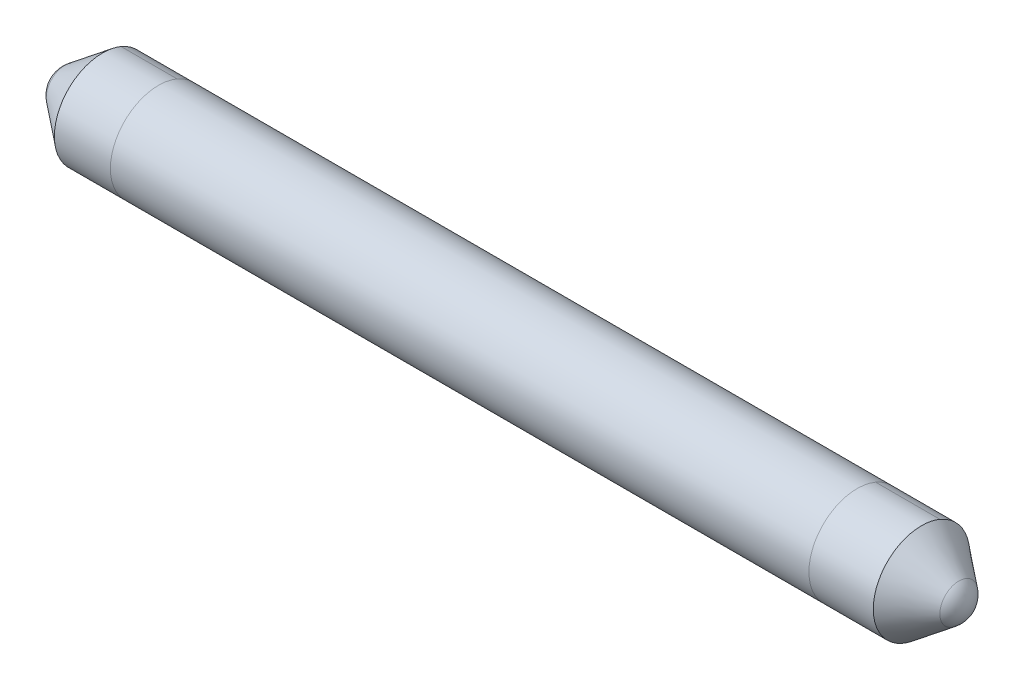
ISO-10303-21;
HEADER;
FILE_DESCRIPTION(('STEP AP214'),'2;1');
FILE_NAME('part.step','',(''),(''),'','','');
FILE_SCHEMA(('AUTOMOTIVE_DESIGN { 1 0 10303 214 1 1 1 1 }'));
ENDSEC;
DATA;
#1=APPLICATION_CONTEXT('core data for automotive mechanical design processes');
#2=APPLICATION_PROTOCOL_DEFINITION('international standard','automotive_design',2000,#1);
#3=PRODUCT_CONTEXT('',#1,'mechanical');
#4=PRODUCT('Part','Part','',(#3));
#5=PRODUCT_RELATED_PRODUCT_CATEGORY('part','',(#4));
#6=PRODUCT_DEFINITION_FORMATION('','',#4);
#7=PRODUCT_DEFINITION_CONTEXT('part definition',#1,'design');
#8=PRODUCT_DEFINITION('design','',#6,#7);
#9=PRODUCT_DEFINITION_SHAPE('','',#8);
#10=(LENGTH_UNIT() NAMED_UNIT(*) SI_UNIT(.MILLI.,.METRE.));
#11=(NAMED_UNIT(*) PLANE_ANGLE_UNIT() SI_UNIT($,.RADIAN.));
#12=(NAMED_UNIT(*) SI_UNIT($,.STERADIAN.) SOLID_ANGLE_UNIT());
#13=UNCERTAINTY_MEASURE_WITH_UNIT(LENGTH_MEASURE(1.E-05),#10,'distance_accuracy_value','');
#14=(GEOMETRIC_REPRESENTATION_CONTEXT(3) GLOBAL_UNCERTAINTY_ASSIGNED_CONTEXT((#13)) GLOBAL_UNIT_ASSIGNED_CONTEXT((#10,
#11,#12)) REPRESENTATION_CONTEXT('',''));
#15=CARTESIAN_POINT('',(0.,0.,0.));
#16=DIRECTION('',(0.,0.,1.));
#17=DIRECTION('',(1.,0.,0.));
#18=AXIS2_PLACEMENT_3D('',#15,#16,#17);
#19=CARTESIAN_POINT('',(0.,-101.643982592585,0.));
#20=DIRECTION('',(1.,0.,0.));
#21=DIRECTION('',(0.,1.,0.));
#22=AXIS2_PLACEMENT_3D('',#19,#20,#21);
#23=CYLINDRICAL_SURFACE('',#22,20.);
#24=DIRECTION('',(1.,0.,0.));
#25=VECTOR('',#24,1.);
#26=CARTESIAN_POINT('',(0.,-119.563848900054,8.88135077127684));
#27=LINE('',#26,#25);
#28=CARTESIAN_POINT('',(-170.,-119.563848900054,8.88135077127685));
#29=VERTEX_POINT('',#28);
#30=CARTESIAN_POINT('',(-146.749372236452,-119.563848900054,8.88135077127684));
#31=VERTEX_POINT('',#30);
#32=EDGE_CURVE('E11',#29,#31,#27,.T.);
#33=ORIENTED_EDGE('',*,*,#32,.F.);
#34=CARTESIAN_POINT('',(-170.,-101.643982592585,0.));
#35=DIRECTION('',(1.,0.,0.));
#36=DIRECTION('',(0.,1.,0.));
#37=AXIS2_PLACEMENT_3D('',#34,#35,#36);
#38=CIRCLE('',#37,20.);
#39=CARTESIAN_POINT('',(-170.,-83.1799390446421,-7.68629272534333));
#40=VERTEX_POINT('',#39);
#41=EDGE_CURVE('E122',#29,#40,#38,.T.);
#42=ORIENTED_EDGE('',*,*,#41,.T.);
#43=DIRECTION('',(1.,0.,0.));
#44=VECTOR('',#43,1.);
#45=CARTESIAN_POINT('',(0.,-83.1799390446422,-7.68629272534332));
#46=LINE('',#45,#44);
#47=CARTESIAN_POINT('',(-146.749372236452,-83.1799390446421,-7.68629272534332));
#48=VERTEX_POINT('',#47);
#49=EDGE_CURVE('E50',#48,#40,#46,.F.);
#50=ORIENTED_EDGE('',*,*,#49,.F.);
#51=CARTESIAN_POINT('',(-146.749372236452,-101.643982592585,0.));
#52=DIRECTION('',(-1.,0.,0.));
#53=DIRECTION('',(0.,0.,1.));
#54=AXIS2_PLACEMENT_3D('',#51,#52,#53);
#55=CIRCLE('',#54,20.);
#56=EDGE_CURVE('E98',#48,#31,#55,.T.);
#57=ORIENTED_EDGE('',*,*,#56,.T.);
#58=EDGE_LOOP('',(#33,#42,#50,#57));
#59=FACE_BOUND('',#58,.T.);
#60=ADVANCED_FACE('F40',(#59),#23,.T.);
#61=DIRECTION('',(1.,0.,0.));
#62=VECTOR('',#61,1.);
#63=CARTESIAN_POINT('',(0.,-119.563848900054,8.88135077127684));
#64=LINE('',#63,#62);
#65=CARTESIAN_POINT('',(143.284700236208,-119.563848900054,8.88135077127684));
#66=VERTEX_POINT('',#65);
#67=CARTESIAN_POINT('',(170.,-119.563848900054,8.88135077127682));
#68=VERTEX_POINT('',#67);
#69=EDGE_CURVE('E92',#66,#68,#64,.T.);
#70=ORIENTED_EDGE('',*,*,#69,.F.);
#71=CARTESIAN_POINT('',(143.284700236208,-101.643982592585,0.));
#72=DIRECTION('',(1.,0.,0.));
#73=DIRECTION('',(0.,0.,-1.));
#74=AXIS2_PLACEMENT_3D('',#71,#72,#73);
#75=CIRCLE('',#74,20.);
#76=CARTESIAN_POINT('',(143.284700236208,-83.1799390446422,-7.68629272534332));
#77=VERTEX_POINT('',#76);
#78=EDGE_CURVE('E94',#66,#77,#75,.T.);
#79=ORIENTED_EDGE('',*,*,#78,.T.);
#80=DIRECTION('',(1.,0.,0.));
#81=VECTOR('',#80,1.);
#82=CARTESIAN_POINT('',(0.,-83.1799390446422,-7.68629272534332));
#83=LINE('',#82,#81);
#84=CARTESIAN_POINT('',(170.,-83.1799390446421,-7.68629272534335));
#85=VERTEX_POINT('',#84);
#86=EDGE_CURVE('E44',#85,#77,#83,.F.);
#87=ORIENTED_EDGE('',*,*,#86,.F.);
#88=CARTESIAN_POINT('',(170.,-101.643982592585,0.));
#89=DIRECTION('',(1.,0.,0.));
#90=DIRECTION('',(0.,1.,0.));
#91=AXIS2_PLACEMENT_3D('',#88,#89,#90);
#92=CIRCLE('',#91,20.);
#93=EDGE_CURVE('E115',#68,#85,#92,.T.);
#94=ORIENTED_EDGE('',*,*,#93,.F.);
#95=EDGE_LOOP('',(#70,#79,#87,#94));
#96=FACE_BOUND('',#95,.T.);
#97=ADVANCED_FACE('F95',(#96),#23,.T.);
#98=ORIENTED_EDGE('',*,*,#56,.F.);
#99=EDGE_CURVE('E125',#31,#48,#55,.T.);
#100=ORIENTED_EDGE('',*,*,#99,.F.);
#101=EDGE_LOOP('',(#98,#100));
#102=FACE_BOUND('',#101,.T.);
#103=EDGE_CURVE('E85',#77,#66,#75,.T.);
#104=ORIENTED_EDGE('',*,*,#103,.F.);
#105=ORIENTED_EDGE('',*,*,#78,.F.);
#106=EDGE_LOOP('',(#104,#105));
#107=FACE_BOUND('',#106,.T.);
#108=ADVANCED_FACE('F100',(#102,#107),#23,.T.);
#109=ORIENTED_EDGE('',*,*,#103,.T.);
#110=ORIENTED_EDGE('',*,*,#69,.T.);
#111=EDGE_CURVE('E87',#85,#68,#92,.T.);
#112=ORIENTED_EDGE('',*,*,#111,.F.);
#113=ORIENTED_EDGE('',*,*,#86,.T.);
#114=EDGE_LOOP('',(#109,#110,#112,#113));
#115=FACE_BOUND('',#114,.T.);
#116=ADVANCED_FACE('F83',(#115),#23,.T.);
#117=CARTESIAN_POINT('',(-179.372661972358,-101.643982592585,0.));
#118=DIRECTION('',(1.,0.,0.));
#119=DIRECTION('',(0.,-1.,0.));
#120=AXIS2_PLACEMENT_3D('',#117,#118,#119);
#121=SPHERICAL_SURFACE('',#120,9.99999999999999);
#122=CARTESIAN_POINT('',(-185.525206376971,-101.643982592585,0.));
#123=DIRECTION('',(1.,0.,0.));
#124=DIRECTION('',(0.,1.,0.));
#125=AXIS2_PLACEMENT_3D('',#122,#123,#124);
#126=CIRCLE('',#125,7.88328594871819);
#127=CARTESIAN_POINT('',(-185.525206376971,-93.7606966438669,0.));
#128=VERTEX_POINT('',#127);
#129=EDGE_CURVE('E123',#128,#128,#126,.T.);
#130=ORIENTED_EDGE('',*,*,#129,.F.);
#131=EDGE_LOOP('',(#130));
#132=FACE_BOUND('',#131,.T.);
#133=ADVANCED_FACE('F42',(#132),#121,.T.);
#134=CARTESIAN_POINT('',(-170.,-101.643982592585,0.));
#135=DIRECTION('',(1.,0.,0.));
#136=DIRECTION('',(0.,1.,0.));
#137=AXIS2_PLACEMENT_3D('',#134,#135,#136);
#138=CONICAL_SURFACE('',#137,20.,0.662708685262541);
#139=ORIENTED_EDGE('',*,*,#129,.T.);
#140=EDGE_LOOP('',(#139));
#141=FACE_BOUND('',#140,.T.);
#142=ORIENTED_EDGE('',*,*,#41,.F.);
#143=EDGE_CURVE('E119',#40,#29,#38,.T.);
#144=ORIENTED_EDGE('',*,*,#143,.F.);
#145=EDGE_LOOP('',(#142,#144));
#146=FACE_BOUND('',#145,.T.);
#147=ADVANCED_FACE('F148',(#141,#146),#138,.T.);
#148=ORIENTED_EDGE('',*,*,#143,.T.);
#149=ORIENTED_EDGE('',*,*,#32,.T.);
#150=ORIENTED_EDGE('',*,*,#99,.T.);
#151=ORIENTED_EDGE('',*,*,#49,.T.);
#152=EDGE_LOOP('',(#148,#149,#150,#151));
#153=FACE_BOUND('',#152,.T.);
#154=ADVANCED_FACE('F141',(#153),#23,.T.);
#155=CARTESIAN_POINT('',(179.372661972358,-101.643982592585,0.));
#156=DIRECTION('',(-1.,0.,0.));
#157=DIRECTION('',(0.,-1.,0.));
#158=AXIS2_PLACEMENT_3D('',#155,#156,#157);
#159=SPHERICAL_SURFACE('',#158,9.99999999999999);
#160=CARTESIAN_POINT('',(185.525206376971,-101.643982592585,0.));
#161=DIRECTION('',(1.,0.,0.));
#162=DIRECTION('',(0.,1.,0.));
#163=AXIS2_PLACEMENT_3D('',#160,#161,#162);
#164=CIRCLE('',#163,7.88328594871819);
#165=CARTESIAN_POINT('',(185.525206376971,-93.7606966438669,0.));
#166=VERTEX_POINT('',#165);
#167=EDGE_CURVE('E117',#166,#166,#164,.T.);
#168=ORIENTED_EDGE('',*,*,#167,.T.);
#169=EDGE_LOOP('',(#168));
#170=FACE_BOUND('',#169,.T.);
#171=ADVANCED_FACE('F147',(#170),#159,.T.);
#172=CARTESIAN_POINT('',(170.,-101.643982592585,0.));
#173=DIRECTION('',(-1.,0.,0.));
#174=DIRECTION('',(0.,1.,0.));
#175=AXIS2_PLACEMENT_3D('',#172,#173,#174);
#176=CONICAL_SURFACE('',#175,20.,0.662708685262541);
#177=ORIENTED_EDGE('',*,*,#167,.F.);
#178=EDGE_LOOP('',(#177));
#179=FACE_BOUND('',#178,.T.);
#180=ORIENTED_EDGE('',*,*,#93,.T.);
#181=ORIENTED_EDGE('',*,*,#111,.T.);
#182=EDGE_LOOP('',(#180,#181));
#183=FACE_BOUND('',#182,.T.);
#184=ADVANCED_FACE('F114',(#179,#183),#176,.T.);
#185=CLOSED_SHELL('',(#60,#97,#108,#116,#133,#147,#154,#171,#184));
#186=MANIFOLD_SOLID_BREP('B2',#185);
#187=ADVANCED_BREP_SHAPE_REPRESENTATION('',(#18,#186),#14);
#188=SHAPE_DEFINITION_REPRESENTATION(#9,#187);
ENDSEC;
END-ISO-10303-21;
